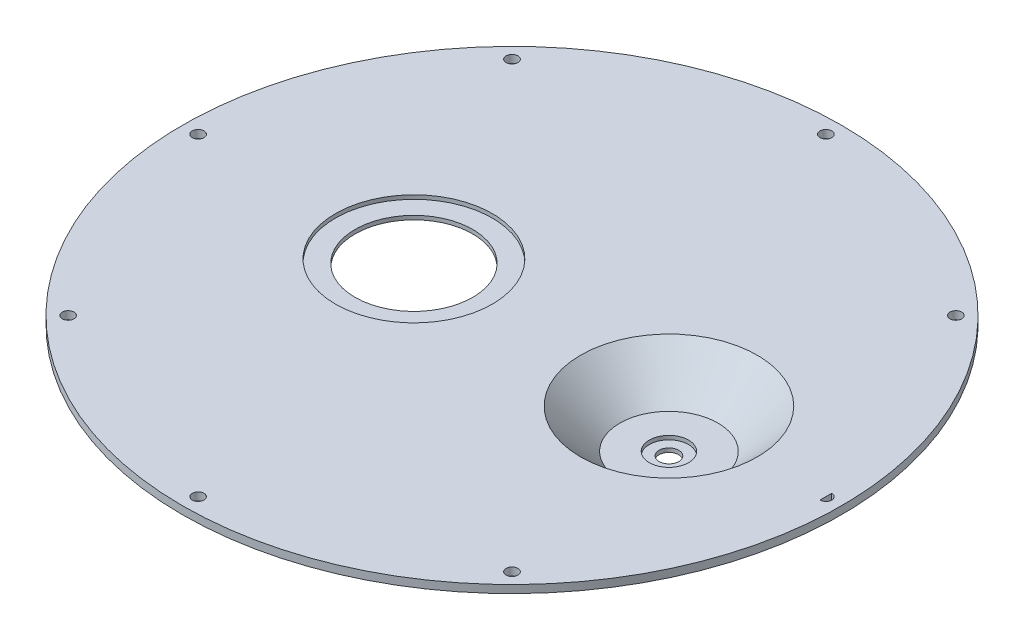
ISO-10303-21;
HEADER;
FILE_DESCRIPTION(('STEP AP214'),'2;1');
FILE_NAME('part.step','',(''),(''),'','','');
FILE_SCHEMA(('AUTOMOTIVE_DESIGN { 1 0 10303 214 1 1 1 1 }'));
ENDSEC;
DATA;
#1=APPLICATION_CONTEXT('core data for automotive mechanical design processes');
#2=APPLICATION_PROTOCOL_DEFINITION('international standard','automotive_design',2000,#1);
#3=PRODUCT_CONTEXT('',#1,'mechanical');
#4=PRODUCT('Part','Part','',(#3));
#5=PRODUCT_RELATED_PRODUCT_CATEGORY('part','',(#4));
#6=PRODUCT_DEFINITION_FORMATION('','',#4);
#7=PRODUCT_DEFINITION_CONTEXT('part definition',#1,'design');
#8=PRODUCT_DEFINITION('design','',#6,#7);
#9=PRODUCT_DEFINITION_SHAPE('','',#8);
#10=(LENGTH_UNIT() NAMED_UNIT(*) SI_UNIT(.MILLI.,.METRE.));
#11=(NAMED_UNIT(*) PLANE_ANGLE_UNIT() SI_UNIT($,.RADIAN.));
#12=(NAMED_UNIT(*) SI_UNIT($,.STERADIAN.) SOLID_ANGLE_UNIT());
#13=UNCERTAINTY_MEASURE_WITH_UNIT(LENGTH_MEASURE(1.E-05),#10,'distance_accuracy_value','');
#14=(GEOMETRIC_REPRESENTATION_CONTEXT(3) GLOBAL_UNCERTAINTY_ASSIGNED_CONTEXT((#13)) GLOBAL_UNIT_ASSIGNED_CONTEXT((#10,
#11,#12)) REPRESENTATION_CONTEXT('',''));
#15=CARTESIAN_POINT('',(0.,0.,0.));
#16=DIRECTION('',(0.,0.,1.));
#17=DIRECTION('',(1.,0.,0.));
#18=AXIS2_PLACEMENT_3D('',#15,#16,#17);
#19=CARTESIAN_POINT('',(-25.,0.,0.));
#20=DIRECTION('',(0.,1.,0.));
#21=DIRECTION('',(0.,0.,1.));
#22=AXIS2_PLACEMENT_3D('',#19,#20,#21);
#23=CYLINDRICAL_SURFACE('',#22,15.);
#24=CARTESIAN_POINT('',(-25.,0.,0.));
#25=DIRECTION('',(0.,1.,0.));
#26=DIRECTION('',(0.,0.,1.));
#27=AXIS2_PLACEMENT_3D('',#24,#25,#26);
#28=CIRCLE('',#27,15.);
#29=CARTESIAN_POINT('',(-25.,0.,15.));
#30=VERTEX_POINT('',#29);
#31=EDGE_CURVE('E112',#30,#30,#28,.T.);
#32=ORIENTED_EDGE('',*,*,#31,.F.);
#33=EDGE_LOOP('',(#32));
#34=FACE_BOUND('',#33,.T.);
#35=CARTESIAN_POINT('',(-25.,1.,0.));
#36=DIRECTION('',(0.,1.,0.));
#37=DIRECTION('',(0.,0.,1.));
#38=AXIS2_PLACEMENT_3D('',#35,#36,#37);
#39=CIRCLE('',#38,15.);
#40=CARTESIAN_POINT('',(-25.,1.,15.));
#41=VERTEX_POINT('',#40);
#42=EDGE_CURVE('E125',#41,#41,#39,.F.);
#43=ORIENTED_EDGE('',*,*,#42,.F.);
#44=EDGE_LOOP('',(#43));
#45=FACE_BOUND('',#44,.T.);
#46=ADVANCED_FACE('F37',(#34,#45),#23,.F.);
#47=CARTESIAN_POINT('',(0.,2.,0.));
#48=DIRECTION('',(0.,-1.,0.));
#49=DIRECTION('',(0.,0.,-1.));
#50=AXIS2_PLACEMENT_3D('',#47,#48,#49);
#51=CYLINDRICAL_SURFACE('',#50,84.);
#52=CARTESIAN_POINT('',(0.,2.,0.));
#53=DIRECTION('',(0.,1.,0.));
#54=DIRECTION('',(0.,0.,1.));
#55=AXIS2_PLACEMENT_3D('',#52,#53,#54);
#56=CIRCLE('',#55,84.);
#57=CARTESIAN_POINT('',(0.,2.,84.));
#58=VERTEX_POINT('',#57);
#59=EDGE_CURVE('E120',#58,#58,#56,.T.);
#60=ORIENTED_EDGE('',*,*,#59,.F.);
#61=EDGE_LOOP('',(#60));
#62=FACE_BOUND('',#61,.T.);
#63=CARTESIAN_POINT('',(0.,0.,0.));
#64=DIRECTION('',(0.,1.,0.));
#65=DIRECTION('',(0.,0.,1.));
#66=AXIS2_PLACEMENT_3D('',#63,#64,#65);
#67=CIRCLE('',#66,84.);
#68=CARTESIAN_POINT('',(0.,0.,84.));
#69=VERTEX_POINT('',#68);
#70=EDGE_CURVE('E116',#69,#69,#67,.T.);
#71=ORIENTED_EDGE('',*,*,#70,.T.);
#72=EDGE_LOOP('',(#71));
#73=FACE_BOUND('',#72,.T.);
#74=ADVANCED_FACE('F39',(#62,#73),#51,.T.);
#75=CARTESIAN_POINT('',(0.,2.,0.));
#76=DIRECTION('',(0.,1.,0.));
#77=DIRECTION('',(0.,0.,1.));
#78=AXIS2_PLACEMENT_3D('',#75,#76,#77);
#79=PLANE('',#78);
#80=CARTESIAN_POINT('',(80.,2.,2.79318507107451E-13));
#81=DIRECTION('',(0.,1.,0.));
#82=DIRECTION('',(0.,0.,1.));
#83=AXIS2_PLACEMENT_3D('',#80,#81,#82);
#84=CIRCLE('',#83,1.5);
#85=CARTESIAN_POINT('',(79.971875,2.00000000000003,1.49973630494692));
#86=VERTEX_POINT('',#85);
#87=CARTESIAN_POINT('',(79.971875,2.00000000000003,-1.49973630494636));
#88=VERTEX_POINT('',#87);
#89=EDGE_CURVE('E69',#86,#88,#84,.T.);
#90=ORIENTED_EDGE('',*,*,#89,.F.);
#91=CARTESIAN_POINT('',(40.,2.00000000000002,0.));
#92=DIRECTION('',(0.,1.,0.));
#93=DIRECTION('',(-1.,0.,0.));
#94=AXIS2_PLACEMENT_3D('',#91,#92,#93);
#95=CIRCLE('',#94,40.);
#96=EDGE_CURVE('E60',#86,#88,#95,.T.);
#97=ORIENTED_EDGE('',*,*,#96,.T.);
#98=EDGE_LOOP('',(#90,#97));
#99=FACE_BOUND('',#98,.T.);
#100=CARTESIAN_POINT('',(-25.,2.,0.));
#101=DIRECTION('',(0.,1.,0.));
#102=DIRECTION('',(0.,0.,1.));
#103=AXIS2_PLACEMENT_3D('',#100,#101,#102);
#104=CIRCLE('',#103,20.);
#105=CARTESIAN_POINT('',(-25.,2.,20.));
#106=VERTEX_POINT('',#105);
#107=EDGE_CURVE('E155',#106,#106,#104,.T.);
#108=ORIENTED_EDGE('',*,*,#107,.F.);
#109=EDGE_LOOP('',(#108));
#110=FACE_BOUND('',#109,.T.);
#111=CARTESIAN_POINT('',(56.5685424949239,2.,-56.5685424949237));
#112=DIRECTION('',(0.,1.,0.));
#113=DIRECTION('',(0.,0.,1.));
#114=AXIS2_PLACEMENT_3D('',#111,#112,#113);
#115=CIRCLE('',#114,1.5);
#116=CARTESIAN_POINT('',(56.5685424949239,2.,-55.0685424949237));
#117=VERTEX_POINT('',#116);
#118=EDGE_CURVE('E77',#117,#117,#115,.T.);
#119=ORIENTED_EDGE('',*,*,#118,.F.);
#120=EDGE_LOOP('',(#119));
#121=FACE_BOUND('',#120,.T.);
#122=CARTESIAN_POINT('',(56.5685424949235,2.,56.5685424949241));
#123=DIRECTION('',(0.,1.,0.));
#124=DIRECTION('',(0.,0.,1.));
#125=AXIS2_PLACEMENT_3D('',#122,#123,#124);
#126=CIRCLE('',#125,1.50000000000001);
#127=CARTESIAN_POINT('',(56.5685424949235,2.,58.0685424949241));
#128=VERTEX_POINT('',#127);
#129=EDGE_CURVE('E79',#128,#128,#126,.T.);
#130=ORIENTED_EDGE('',*,*,#129,.F.);
#131=EDGE_LOOP('',(#130));
#132=FACE_BOUND('',#131,.T.);
#133=CARTESIAN_POINT('',(-5.58637014214901E-13,2.,80.));
#134=DIRECTION('',(0.,1.,0.));
#135=DIRECTION('',(0.,0.,1.));
#136=AXIS2_PLACEMENT_3D('',#133,#134,#135);
#137=CIRCLE('',#136,1.5);
#138=CARTESIAN_POINT('',(-5.58637014214901E-13,2.,81.5));
#139=VERTEX_POINT('',#138);
#140=EDGE_CURVE('E88',#139,#139,#137,.T.);
#141=ORIENTED_EDGE('',*,*,#140,.F.);
#142=EDGE_LOOP('',(#141));
#143=FACE_BOUND('',#142,.T.);
#144=CARTESIAN_POINT('',(-56.5685424949243,2.,56.5685424949233));
#145=DIRECTION('',(0.,1.,0.));
#146=DIRECTION('',(0.,0.,1.));
#147=AXIS2_PLACEMENT_3D('',#144,#145,#146);
#148=CIRCLE('',#147,1.5);
#149=CARTESIAN_POINT('',(-56.5685424949243,2.,58.0685424949233));
#150=VERTEX_POINT('',#149);
#151=EDGE_CURVE('E94',#150,#150,#148,.T.);
#152=ORIENTED_EDGE('',*,*,#151,.F.);
#153=EDGE_LOOP('',(#152));
#154=FACE_BOUND('',#153,.T.);
#155=CARTESIAN_POINT('',(-80.,2.,-8.37955521322352E-13));
#156=DIRECTION('',(0.,1.,0.));
#157=DIRECTION('',(0.,0.,1.));
#158=AXIS2_PLACEMENT_3D('',#155,#156,#157);
#159=CIRCLE('',#158,1.5);
#160=CARTESIAN_POINT('',(-80.,2.,1.49999999999916));
#161=VERTEX_POINT('',#160);
#162=EDGE_CURVE('E100',#161,#161,#159,.T.);
#163=ORIENTED_EDGE('',*,*,#162,.F.);
#164=EDGE_LOOP('',(#163));
#165=FACE_BOUND('',#164,.T.);
#166=CARTESIAN_POINT('',(-56.5685424949231,2.,-56.5685424949245));
#167=DIRECTION('',(0.,1.,0.));
#168=DIRECTION('',(0.,0.,1.));
#169=AXIS2_PLACEMENT_3D('',#166,#167,#168);
#170=CIRCLE('',#169,1.5);
#171=CARTESIAN_POINT('',(-56.5685424949231,2.,-55.0685424949245));
#172=VERTEX_POINT('',#171);
#173=EDGE_CURVE('E106',#172,#172,#170,.T.);
#174=ORIENTED_EDGE('',*,*,#173,.F.);
#175=EDGE_LOOP('',(#174));
#176=FACE_BOUND('',#175,.T.);
#177=CARTESIAN_POINT('',(0.,2.,-80.));
#178=DIRECTION('',(0.,1.,0.));
#179=DIRECTION('',(0.,0.,1.));
#180=AXIS2_PLACEMENT_3D('',#177,#178,#179);
#181=CIRCLE('',#180,1.5);
#182=CARTESIAN_POINT('',(0.,2.,-78.5));
#183=VERTEX_POINT('',#182);
#184=EDGE_CURVE('E117',#183,#183,#181,.T.);
#185=ORIENTED_EDGE('',*,*,#184,.F.);
#186=EDGE_LOOP('',(#185));
#187=FACE_BOUND('',#186,.T.);
#188=ORIENTED_EDGE('',*,*,#59,.T.);
#189=EDGE_LOOP('',(#188));
#190=FACE_BOUND('',#189,.T.);
#191=CARTESIAN_POINT('',(40.,2.,0.));
#192=DIRECTION('',(0.,1.,0.));
#193=DIRECTION('',(0.,0.,1.));
#194=AXIS2_PLACEMENT_3D('',#191,#192,#193);
#195=CIRCLE('',#194,22.5);
#196=CARTESIAN_POINT('',(40.,2.,22.5));
#197=VERTEX_POINT('',#196);
#198=EDGE_CURVE('E127',#197,#197,#195,.T.);
#199=ORIENTED_EDGE('',*,*,#198,.F.);
#200=EDGE_LOOP('',(#199));
#201=FACE_BOUND('',#200,.T.);
#202=ADVANCED_FACE('F72',(#99,#110,#121,#132,#143,#154,#165,#176,#187,#190,#201),#79,.T.);
#203=CARTESIAN_POINT('',(0.,0.,0.));
#204=DIRECTION('',(0.,1.,0.));
#205=DIRECTION('',(0.,0.,1.));
#206=AXIS2_PLACEMENT_3D('',#203,#204,#205);
#207=PLANE('',#206);
#208=ORIENTED_EDGE('',*,*,#31,.T.);
#209=EDGE_LOOP('',(#208));
#210=FACE_BOUND('',#209,.T.);
#211=CARTESIAN_POINT('',(56.5685424949239,0.,-56.5685424949237));
#212=DIRECTION('',(0.,1.,0.));
#213=DIRECTION('',(0.,0.,1.));
#214=AXIS2_PLACEMENT_3D('',#211,#212,#213);
#215=CIRCLE('',#214,1.5);
#216=CARTESIAN_POINT('',(56.5685424949239,0.,-55.0685424949237));
#217=VERTEX_POINT('',#216);
#218=EDGE_CURVE('E74',#217,#217,#215,.T.);
#219=ORIENTED_EDGE('',*,*,#218,.T.);
#220=EDGE_LOOP('',(#219));
#221=FACE_BOUND('',#220,.T.);
#222=CARTESIAN_POINT('',(80.,0.,2.79318507107451E-13));
#223=DIRECTION('',(0.,1.,0.));
#224=DIRECTION('',(0.,0.,1.));
#225=AXIS2_PLACEMENT_3D('',#222,#223,#224);
#226=CIRCLE('',#225,1.5);
#227=CARTESIAN_POINT('',(79.971875,0.,1.49973630494692));
#228=VERTEX_POINT('',#227);
#229=CARTESIAN_POINT('',(79.971875,0.,-1.49973630494636));
#230=VERTEX_POINT('',#229);
#231=EDGE_CURVE('E71',#228,#230,#226,.T.);
#232=ORIENTED_EDGE('',*,*,#231,.T.);
#233=CARTESIAN_POINT('',(40.,0.,0.));
#234=DIRECTION('',(0.,1.,0.));
#235=DIRECTION('',(-1.,0.,0.));
#236=AXIS2_PLACEMENT_3D('',#233,#234,#235);
#237=CIRCLE('',#236,40.);
#238=EDGE_CURVE('E52',#228,#230,#237,.T.);
#239=ORIENTED_EDGE('',*,*,#238,.F.);
#240=EDGE_LOOP('',(#232,#239));
#241=FACE_BOUND('',#240,.T.);
#242=CARTESIAN_POINT('',(56.5685424949235,0.,56.5685424949241));
#243=DIRECTION('',(0.,1.,0.));
#244=DIRECTION('',(0.,0.,1.));
#245=AXIS2_PLACEMENT_3D('',#242,#243,#244);
#246=CIRCLE('',#245,1.50000000000001);
#247=CARTESIAN_POINT('',(56.5685424949235,0.,58.0685424949241));
#248=VERTEX_POINT('',#247);
#249=EDGE_CURVE('E85',#248,#248,#246,.T.);
#250=ORIENTED_EDGE('',*,*,#249,.T.);
#251=EDGE_LOOP('',(#250));
#252=FACE_BOUND('',#251,.T.);
#253=CARTESIAN_POINT('',(-5.58637014214901E-13,0.,80.));
#254=DIRECTION('',(0.,1.,0.));
#255=DIRECTION('',(0.,0.,1.));
#256=AXIS2_PLACEMENT_3D('',#253,#254,#255);
#257=CIRCLE('',#256,1.5);
#258=CARTESIAN_POINT('',(-5.58637014214901E-13,0.,81.5));
#259=VERTEX_POINT('',#258);
#260=EDGE_CURVE('E91',#259,#259,#257,.T.);
#261=ORIENTED_EDGE('',*,*,#260,.T.);
#262=EDGE_LOOP('',(#261));
#263=FACE_BOUND('',#262,.T.);
#264=CARTESIAN_POINT('',(-56.5685424949243,0.,56.5685424949233));
#265=DIRECTION('',(0.,1.,0.));
#266=DIRECTION('',(0.,0.,1.));
#267=AXIS2_PLACEMENT_3D('',#264,#265,#266);
#268=CIRCLE('',#267,1.5);
#269=CARTESIAN_POINT('',(-56.5685424949243,0.,58.0685424949233));
#270=VERTEX_POINT('',#269);
#271=EDGE_CURVE('E97',#270,#270,#268,.T.);
#272=ORIENTED_EDGE('',*,*,#271,.T.);
#273=EDGE_LOOP('',(#272));
#274=FACE_BOUND('',#273,.T.);
#275=CARTESIAN_POINT('',(-80.,0.,-8.37955521322352E-13));
#276=DIRECTION('',(0.,1.,0.));
#277=DIRECTION('',(0.,0.,1.));
#278=AXIS2_PLACEMENT_3D('',#275,#276,#277);
#279=CIRCLE('',#278,1.5);
#280=CARTESIAN_POINT('',(-80.,0.,1.49999999999916));
#281=VERTEX_POINT('',#280);
#282=EDGE_CURVE('E103',#281,#281,#279,.T.);
#283=ORIENTED_EDGE('',*,*,#282,.T.);
#284=EDGE_LOOP('',(#283));
#285=FACE_BOUND('',#284,.T.);
#286=CARTESIAN_POINT('',(-56.5685424949231,0.,-56.5685424949245));
#287=DIRECTION('',(0.,1.,0.));
#288=DIRECTION('',(0.,0.,1.));
#289=AXIS2_PLACEMENT_3D('',#286,#287,#288);
#290=CIRCLE('',#289,1.5);
#291=CARTESIAN_POINT('',(-56.5685424949231,0.,-55.0685424949245));
#292=VERTEX_POINT('',#291);
#293=EDGE_CURVE('E109',#292,#292,#290,.T.);
#294=ORIENTED_EDGE('',*,*,#293,.T.);
#295=EDGE_LOOP('',(#294));
#296=FACE_BOUND('',#295,.T.);
#297=CARTESIAN_POINT('',(0.,0.,-80.));
#298=DIRECTION('',(0.,1.,0.));
#299=DIRECTION('',(0.,0.,1.));
#300=AXIS2_PLACEMENT_3D('',#297,#298,#299);
#301=CIRCLE('',#300,1.5);
#302=CARTESIAN_POINT('',(0.,0.,-78.5));
#303=VERTEX_POINT('',#302);
#304=EDGE_CURVE('E113',#303,#303,#301,.T.);
#305=ORIENTED_EDGE('',*,*,#304,.T.);
#306=EDGE_LOOP('',(#305));
#307=FACE_BOUND('',#306,.T.);
#308=ORIENTED_EDGE('',*,*,#70,.F.);
#309=EDGE_LOOP('',(#308));
#310=FACE_BOUND('',#309,.T.);
#311=CARTESIAN_POINT('',(40.,0.,0.));
#312=DIRECTION('',(0.,1.,0.));
#313=DIRECTION('',(-1.,0.,0.));
#314=AXIS2_PLACEMENT_3D('',#311,#312,#313);
#315=CIRCLE('',#314,23.91);
#316=CARTESIAN_POINT('',(16.09,0.,0.));
#317=VERTEX_POINT('',#316);
#318=EDGE_CURVE('E132',#317,#317,#315,.T.);
#319=ORIENTED_EDGE('',*,*,#318,.T.);
#320=EDGE_LOOP('',(#319));
#321=FACE_BOUND('',#320,.T.);
#322=ADVANCED_FACE('F130',(#210,#221,#241,#252,#263,#274,#285,#296,#307,#310,#321),#207,.F.);
#323=CARTESIAN_POINT('',(0.,0.,-80.));
#324=DIRECTION('',(0.,1.,0.));
#325=DIRECTION('',(0.,0.,1.));
#326=AXIS2_PLACEMENT_3D('',#323,#324,#325);
#327=CYLINDRICAL_SURFACE('',#326,1.5);
#328=ORIENTED_EDGE('',*,*,#304,.F.);
#329=EDGE_LOOP('',(#328));
#330=FACE_BOUND('',#329,.T.);
#331=ORIENTED_EDGE('',*,*,#184,.T.);
#332=EDGE_LOOP('',(#331));
#333=FACE_BOUND('',#332,.T.);
#334=ADVANCED_FACE('F239',(#330,#333),#327,.F.);
#335=CARTESIAN_POINT('',(-56.5685424949231,0.,-56.5685424949245));
#336=DIRECTION('',(0.,1.,0.));
#337=DIRECTION('',(0.,0.,1.));
#338=AXIS2_PLACEMENT_3D('',#335,#336,#337);
#339=CYLINDRICAL_SURFACE('',#338,1.5);
#340=ORIENTED_EDGE('',*,*,#293,.F.);
#341=EDGE_LOOP('',(#340));
#342=FACE_BOUND('',#341,.T.);
#343=ORIENTED_EDGE('',*,*,#173,.T.);
#344=EDGE_LOOP('',(#343));
#345=FACE_BOUND('',#344,.T.);
#346=ADVANCED_FACE('F235',(#342,#345),#339,.F.);
#347=CARTESIAN_POINT('',(-80.,0.,-8.37955521322352E-13));
#348=DIRECTION('',(0.,1.,0.));
#349=DIRECTION('',(0.,0.,1.));
#350=AXIS2_PLACEMENT_3D('',#347,#348,#349);
#351=CYLINDRICAL_SURFACE('',#350,1.5);
#352=ORIENTED_EDGE('',*,*,#282,.F.);
#353=EDGE_LOOP('',(#352));
#354=FACE_BOUND('',#353,.T.);
#355=ORIENTED_EDGE('',*,*,#162,.T.);
#356=EDGE_LOOP('',(#355));
#357=FACE_BOUND('',#356,.T.);
#358=ADVANCED_FACE('F231',(#354,#357),#351,.F.);
#359=CARTESIAN_POINT('',(-56.5685424949243,0.,56.5685424949233));
#360=DIRECTION('',(0.,1.,0.));
#361=DIRECTION('',(0.,0.,1.));
#362=AXIS2_PLACEMENT_3D('',#359,#360,#361);
#363=CYLINDRICAL_SURFACE('',#362,1.5);
#364=ORIENTED_EDGE('',*,*,#271,.F.);
#365=EDGE_LOOP('',(#364));
#366=FACE_BOUND('',#365,.T.);
#367=ORIENTED_EDGE('',*,*,#151,.T.);
#368=EDGE_LOOP('',(#367));
#369=FACE_BOUND('',#368,.T.);
#370=ADVANCED_FACE('F227',(#366,#369),#363,.F.);
#371=CARTESIAN_POINT('',(-5.58637014214901E-13,0.,80.));
#372=DIRECTION('',(0.,1.,0.));
#373=DIRECTION('',(0.,0.,1.));
#374=AXIS2_PLACEMENT_3D('',#371,#372,#373);
#375=CYLINDRICAL_SURFACE('',#374,1.5);
#376=ORIENTED_EDGE('',*,*,#260,.F.);
#377=EDGE_LOOP('',(#376));
#378=FACE_BOUND('',#377,.T.);
#379=ORIENTED_EDGE('',*,*,#140,.T.);
#380=EDGE_LOOP('',(#379));
#381=FACE_BOUND('',#380,.T.);
#382=ADVANCED_FACE('F223',(#378,#381),#375,.F.);
#383=CARTESIAN_POINT('',(56.5685424949235,0.,56.5685424949241));
#384=DIRECTION('',(0.,1.,0.));
#385=DIRECTION('',(0.,0.,1.));
#386=AXIS2_PLACEMENT_3D('',#383,#384,#385);
#387=CYLINDRICAL_SURFACE('',#386,1.50000000000001);
#388=ORIENTED_EDGE('',*,*,#249,.F.);
#389=EDGE_LOOP('',(#388));
#390=FACE_BOUND('',#389,.T.);
#391=ORIENTED_EDGE('',*,*,#129,.T.);
#392=EDGE_LOOP('',(#391));
#393=FACE_BOUND('',#392,.T.);
#394=ADVANCED_FACE('F220',(#390,#393),#387,.F.);
#395=CARTESIAN_POINT('',(80.,0.,2.79318507107451E-13));
#396=DIRECTION('',(0.,1.,0.));
#397=DIRECTION('',(0.,0.,1.));
#398=AXIS2_PLACEMENT_3D('',#395,#396,#397);
#399=CYLINDRICAL_SURFACE('',#398,1.5);
#400=ORIENTED_EDGE('',*,*,#231,.F.);
#401=DIRECTION('',(0.,1.,0.));
#402=VECTOR('',#401,1.);
#403=CARTESIAN_POINT('',(79.971875,1.00000000000003,1.49973630494692));
#404=LINE('',#403,#402);
#405=EDGE_CURVE('E11',#228,#86,#404,.T.);
#406=ORIENTED_EDGE('',*,*,#405,.T.);
#407=ORIENTED_EDGE('',*,*,#89,.T.);
#408=DIRECTION('',(0.,1.,0.));
#409=VECTOR('',#408,1.);
#410=CARTESIAN_POINT('',(79.971875,1.00000000000003,-1.49973630494636));
#411=LINE('',#410,#409);
#412=EDGE_CURVE('E45',#88,#230,#411,.F.);
#413=ORIENTED_EDGE('',*,*,#412,.T.);
#414=EDGE_LOOP('',(#400,#406,#407,#413));
#415=FACE_BOUND('',#414,.T.);
#416=ADVANCED_FACE('F68',(#415),#399,.F.);
#417=CARTESIAN_POINT('',(56.5685424949239,0.,-56.5685424949237));
#418=DIRECTION('',(0.,1.,0.));
#419=DIRECTION('',(0.,0.,1.));
#420=AXIS2_PLACEMENT_3D('',#417,#418,#419);
#421=CYLINDRICAL_SURFACE('',#420,1.5);
#422=ORIENTED_EDGE('',*,*,#218,.F.);
#423=EDGE_LOOP('',(#422));
#424=FACE_BOUND('',#423,.T.);
#425=ORIENTED_EDGE('',*,*,#118,.T.);
#426=EDGE_LOOP('',(#425));
#427=FACE_BOUND('',#426,.T.);
#428=ADVANCED_FACE('F166',(#424,#427),#421,.F.);
#429=CARTESIAN_POINT('',(-25.,1.,0.));
#430=DIRECTION('',(0.,1.,0.));
#431=DIRECTION('',(0.,0.,1.));
#432=AXIS2_PLACEMENT_3D('',#429,#430,#431);
#433=PLANE('',#432);
#434=CARTESIAN_POINT('',(-25.,1.,0.));
#435=DIRECTION('',(0.,1.,0.));
#436=DIRECTION('',(0.,0.,1.));
#437=AXIS2_PLACEMENT_3D('',#434,#435,#436);
#438=CIRCLE('',#437,20.);
#439=CARTESIAN_POINT('',(-25.,1.,20.));
#440=VERTEX_POINT('',#439);
#441=EDGE_CURVE('E128',#440,#440,#438,.T.);
#442=ORIENTED_EDGE('',*,*,#441,.T.);
#443=EDGE_LOOP('',(#442));
#444=FACE_BOUND('',#443,.T.);
#445=ORIENTED_EDGE('',*,*,#42,.T.);
#446=EDGE_LOOP('',(#445));
#447=FACE_BOUND('',#446,.T.);
#448=ADVANCED_FACE('F216',(#444,#447),#433,.T.);
#449=CARTESIAN_POINT('',(-25.,1.,0.));
#450=DIRECTION('',(0.,1.,0.));
#451=DIRECTION('',(0.,0.,1.));
#452=AXIS2_PLACEMENT_3D('',#449,#450,#451);
#453=CYLINDRICAL_SURFACE('',#452,20.);
#454=ORIENTED_EDGE('',*,*,#441,.F.);
#455=EDGE_LOOP('',(#454));
#456=FACE_BOUND('',#455,.T.);
#457=ORIENTED_EDGE('',*,*,#107,.T.);
#458=EDGE_LOOP('',(#457));
#459=FACE_BOUND('',#458,.T.);
#460=ADVANCED_FACE('F214',(#456,#459),#453,.F.);
#461=CARTESIAN_POINT('',(40.,0.,0.));
#462=DIRECTION('',(0.,1.,0.));
#463=DIRECTION('',(-1.,0.,0.));
#464=AXIS2_PLACEMENT_3D('',#461,#462,#463);
#465=CONICAL_SURFACE('',#464,23.91,0.785398163397446);
#466=CARTESIAN_POINT('',(40.,-9.99848988597779,0.));
#467=DIRECTION('',(0.,1.,0.));
#468=DIRECTION('',(-1.,0.,0.));
#469=AXIS2_PLACEMENT_3D('',#466,#467,#468);
#470=CIRCLE('',#469,13.9115101140222);
#471=CARTESIAN_POINT('',(26.0884898859778,-9.9984898859778,0.));
#472=VERTEX_POINT('',#471);
#473=EDGE_CURVE('E135',#472,#472,#470,.T.);
#474=ORIENTED_EDGE('',*,*,#473,.T.);
#475=EDGE_LOOP('',(#474));
#476=FACE_BOUND('',#475,.T.);
#477=ORIENTED_EDGE('',*,*,#318,.F.);
#478=EDGE_LOOP('',(#477));
#479=FACE_BOUND('',#478,.T.);
#480=ADVANCED_FACE('F263',(#476,#479),#465,.T.);
#481=CARTESIAN_POINT('',(37.4984898859778,-9.99848988597779,0.));
#482=DIRECTION('',(0.,1.,0.));
#483=DIRECTION('',(-1.,0.,0.));
#484=AXIS2_PLACEMENT_3D('',#481,#482,#483);
#485=PLANE('',#484);
#486=ORIENTED_EDGE('',*,*,#473,.F.);
#487=EDGE_LOOP('',(#486));
#488=FACE_BOUND('',#487,.T.);
#489=CARTESIAN_POINT('',(40.,-9.99848988597779,0.));
#490=DIRECTION('',(0.,1.,0.));
#491=DIRECTION('',(-1.,0.,0.));
#492=AXIS2_PLACEMENT_3D('',#489,#490,#491);
#493=CIRCLE('',#492,2.50151011402224);
#494=CARTESIAN_POINT('',(37.4984898859778,-9.99848988597779,0.));
#495=VERTEX_POINT('',#494);
#496=EDGE_CURVE('E140',#495,#495,#493,.T.);
#497=ORIENTED_EDGE('',*,*,#496,.T.);
#498=EDGE_LOOP('',(#497));
#499=FACE_BOUND('',#498,.T.);
#500=ADVANCED_FACE('F270',(#488,#499),#485,.F.);
#501=CARTESIAN_POINT('',(40.,0.,0.));
#502=DIRECTION('',(0.,1.,0.));
#503=DIRECTION('',(-1.,0.,0.));
#504=AXIS2_PLACEMENT_3D('',#501,#502,#503);
#505=CYLINDRICAL_SURFACE('',#504,2.50151011402224);
#506=CARTESIAN_POINT('',(40.,-8.99848988597778,0.));
#507=DIRECTION('',(0.,1.,0.));
#508=DIRECTION('',(-1.,0.,0.));
#509=AXIS2_PLACEMENT_3D('',#506,#507,#508);
#510=CIRCLE('',#509,2.50151011402224);
#511=CARTESIAN_POINT('',(37.4984898859778,-8.99848988597778,0.));
#512=VERTEX_POINT('',#511);
#513=EDGE_CURVE('E143',#512,#512,#510,.T.);
#514=ORIENTED_EDGE('',*,*,#513,.T.);
#515=EDGE_LOOP('',(#514));
#516=FACE_BOUND('',#515,.T.);
#517=ORIENTED_EDGE('',*,*,#496,.F.);
#518=EDGE_LOOP('',(#517));
#519=FACE_BOUND('',#518,.T.);
#520=ADVANCED_FACE('F278',(#516,#519),#505,.F.);
#521=CARTESIAN_POINT('',(34.9984898859778,-8.99848988597778,0.));
#522=DIRECTION('',(0.,-1.,0.));
#523=DIRECTION('',(1.,0.,0.));
#524=AXIS2_PLACEMENT_3D('',#521,#522,#523);
#525=PLANE('',#524);
#526=ORIENTED_EDGE('',*,*,#513,.F.);
#527=EDGE_LOOP('',(#526));
#528=FACE_BOUND('',#527,.T.);
#529=CARTESIAN_POINT('',(40.,-8.99848988597778,0.));
#530=DIRECTION('',(0.,1.,0.));
#531=DIRECTION('',(-1.,0.,0.));
#532=AXIS2_PLACEMENT_3D('',#529,#530,#531);
#533=CIRCLE('',#532,5.00151011402224);
#534=CARTESIAN_POINT('',(34.9984898859778,-8.99848988597778,0.));
#535=VERTEX_POINT('',#534);
#536=EDGE_CURVE('E146',#535,#535,#533,.T.);
#537=ORIENTED_EDGE('',*,*,#536,.T.);
#538=EDGE_LOOP('',(#537));
#539=FACE_BOUND('',#538,.T.);
#540=ADVANCED_FACE('F286',(#528,#539),#525,.F.);
#541=CARTESIAN_POINT('',(40.,0.,0.));
#542=DIRECTION('',(0.,1.,0.));
#543=DIRECTION('',(-1.,0.,0.));
#544=AXIS2_PLACEMENT_3D('',#541,#542,#543);
#545=CYLINDRICAL_SURFACE('',#544,5.00151011402224);
#546=ORIENTED_EDGE('',*,*,#536,.F.);
#547=EDGE_LOOP('',(#546));
#548=FACE_BOUND('',#547,.T.);
#549=CARTESIAN_POINT('',(40.,-7.99848988597778,0.));
#550=DIRECTION('',(0.,1.,0.));
#551=DIRECTION('',(-1.,0.,0.));
#552=AXIS2_PLACEMENT_3D('',#549,#550,#551);
#553=CIRCLE('',#552,5.00151011402224);
#554=CARTESIAN_POINT('',(34.9984898859778,-7.99848988597778,0.));
#555=VERTEX_POINT('',#554);
#556=EDGE_CURVE('E149',#555,#555,#553,.T.);
#557=ORIENTED_EDGE('',*,*,#556,.T.);
#558=EDGE_LOOP('',(#557));
#559=FACE_BOUND('',#558,.T.);
#560=ADVANCED_FACE('F197',(#548,#559),#545,.F.);
#561=CARTESIAN_POINT('',(27.4984898859778,-7.99848988597778,0.));
#562=DIRECTION('',(0.,-1.,0.));
#563=DIRECTION('',(1.,0.,0.));
#564=AXIS2_PLACEMENT_3D('',#561,#562,#563);
#565=PLANE('',#564);
#566=ORIENTED_EDGE('',*,*,#556,.F.);
#567=EDGE_LOOP('',(#566));
#568=FACE_BOUND('',#567,.T.);
#569=CARTESIAN_POINT('',(40.,-7.99848988597777,0.));
#570=DIRECTION('',(0.,1.,0.));
#571=DIRECTION('',(-1.,0.,0.));
#572=AXIS2_PLACEMENT_3D('',#569,#570,#571);
#573=CIRCLE('',#572,12.5015101140222);
#574=CARTESIAN_POINT('',(27.4984898859778,-7.99848988597778,0.));
#575=VERTEX_POINT('',#574);
#576=EDGE_CURVE('E152',#575,#575,#573,.T.);
#577=ORIENTED_EDGE('',*,*,#576,.T.);
#578=EDGE_LOOP('',(#577));
#579=FACE_BOUND('',#578,.T.);
#580=ADVANCED_FACE('F189',(#568,#579),#565,.F.);
#581=CARTESIAN_POINT('',(40.,2.00000000000003,0.));
#582=DIRECTION('',(0.,1.,0.));
#583=DIRECTION('',(-1.,0.,0.));
#584=AXIS2_PLACEMENT_3D('',#581,#582,#583);
#585=CONICAL_SURFACE('',#584,22.5,0.785398163397446);
#586=ORIENTED_EDGE('',*,*,#576,.F.);
#587=EDGE_LOOP('',(#586));
#588=FACE_BOUND('',#587,.T.);
#589=ORIENTED_EDGE('',*,*,#198,.T.);
#590=EDGE_LOOP('',(#589));
#591=FACE_BOUND('',#590,.T.);
#592=ADVANCED_FACE('F187',(#588,#591),#585,.F.);
#593=CARTESIAN_POINT('',(40.,0.,0.));
#594=DIRECTION('',(0.,1.,0.));
#595=DIRECTION('',(-1.,0.,0.));
#596=AXIS2_PLACEMENT_3D('',#593,#594,#595);
#597=CYLINDRICAL_SURFACE('',#596,40.);
#598=ORIENTED_EDGE('',*,*,#405,.F.);
#599=ORIENTED_EDGE('',*,*,#238,.T.);
#600=ORIENTED_EDGE('',*,*,#412,.F.);
#601=ORIENTED_EDGE('',*,*,#96,.F.);
#602=EDGE_LOOP('',(#598,#599,#600,#601));
#603=FACE_BOUND('',#602,.T.);
#604=ADVANCED_FACE('F61',(#603),#597,.T.);
#605=CLOSED_SHELL('',(#46,#74,#202,#322,#334,#346,#358,#370,#382,#394,#416,#428,#448,#460,#480,
#500,#520,#540,#560,#580,#592,#604));
#606=MANIFOLD_SOLID_BREP('B2',#605);
#607=ADVANCED_BREP_SHAPE_REPRESENTATION('',(#18,#606),#14);
#608=SHAPE_DEFINITION_REPRESENTATION(#9,#607);
ENDSEC;
END-ISO-10303-21;
